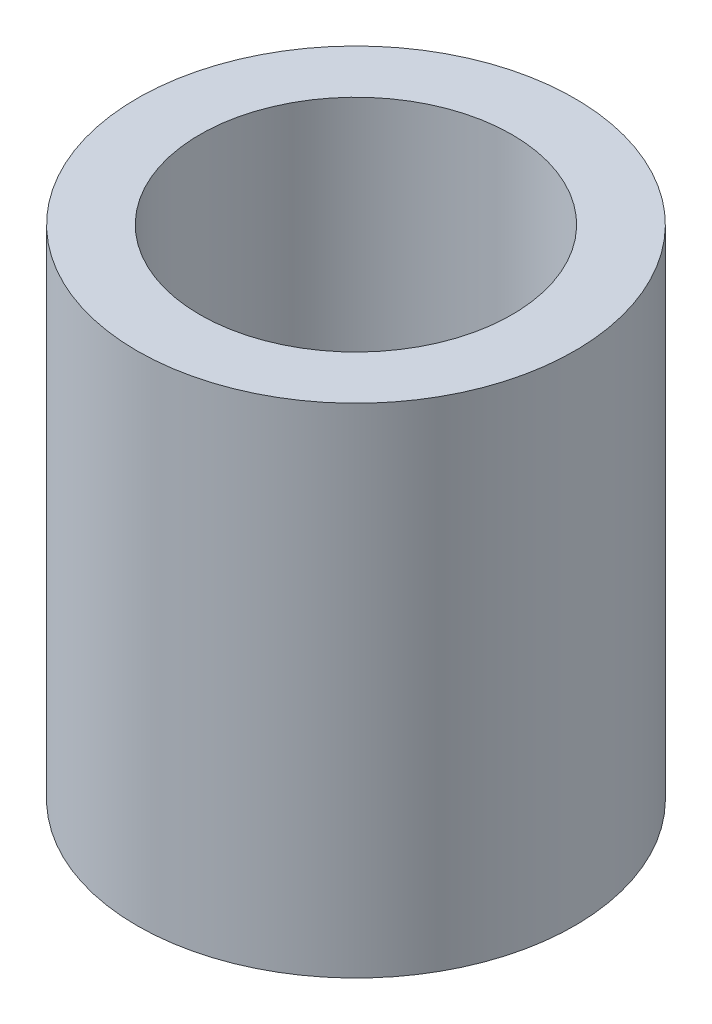
ISO-10303-21;
HEADER;
FILE_DESCRIPTION(('STEP AP214'),'2;1');
FILE_NAME('part.step','',(''),(''),'','','');
FILE_SCHEMA(('AUTOMOTIVE_DESIGN { 1 0 10303 214 1 1 1 1 }'));
ENDSEC;
DATA;
#1=APPLICATION_CONTEXT('core data for automotive mechanical design processes');
#2=APPLICATION_PROTOCOL_DEFINITION('international standard','automotive_design',2000,#1);
#3=PRODUCT_CONTEXT('',#1,'mechanical');
#4=PRODUCT('Part','Part','',(#3));
#5=PRODUCT_RELATED_PRODUCT_CATEGORY('part','',(#4));
#6=PRODUCT_DEFINITION_FORMATION('','',#4);
#7=PRODUCT_DEFINITION_CONTEXT('part definition',#1,'design');
#8=PRODUCT_DEFINITION('design','',#6,#7);
#9=PRODUCT_DEFINITION_SHAPE('','',#8);
#10=(LENGTH_UNIT() NAMED_UNIT(*) SI_UNIT(.MILLI.,.METRE.));
#11=(NAMED_UNIT(*) PLANE_ANGLE_UNIT() SI_UNIT($,.RADIAN.));
#12=(NAMED_UNIT(*) SI_UNIT($,.STERADIAN.) SOLID_ANGLE_UNIT());
#13=UNCERTAINTY_MEASURE_WITH_UNIT(LENGTH_MEASURE(1.E-05),#10,'distance_accuracy_value','');
#14=(GEOMETRIC_REPRESENTATION_CONTEXT(3) GLOBAL_UNCERTAINTY_ASSIGNED_CONTEXT((#13)) GLOBAL_UNIT_ASSIGNED_CONTEXT((#10,
#11,#12)) REPRESENTATION_CONTEXT('',''));
#15=CARTESIAN_POINT('',(0.,0.,0.));
#16=DIRECTION('',(0.,0.,1.));
#17=DIRECTION('',(1.,0.,0.));
#18=AXIS2_PLACEMENT_3D('',#15,#16,#17);
#19=CARTESIAN_POINT('',(0.,12.7,0.));
#20=DIRECTION('',(0.,1.,0.));
#21=DIRECTION('',(0.,0.,1.));
#22=AXIS2_PLACEMENT_3D('',#19,#20,#21);
#23=PLANE('',#22);
#24=CARTESIAN_POINT('',(0.,12.7,0.));
#25=DIRECTION('',(0.,1.,0.));
#26=DIRECTION('',(0.,0.,1.));
#27=AXIS2_PLACEMENT_3D('',#24,#25,#26);
#28=CIRCLE('',#27,5.58165);
#29=CARTESIAN_POINT('',(0.,12.7,5.58165));
#30=VERTEX_POINT('',#29);
#31=EDGE_CURVE('E10',#30,#30,#28,.T.);
#32=ORIENTED_EDGE('',*,*,#31,.T.);
#33=EDGE_LOOP('',(#32));
#34=FACE_BOUND('',#33,.T.);
#35=CARTESIAN_POINT('',(0.,12.7,0.));
#36=DIRECTION('',(0.,1.,0.));
#37=DIRECTION('',(0.,0.,1.));
#38=AXIS2_PLACEMENT_3D('',#35,#36,#37);
#39=CIRCLE('',#38,3.98145);
#40=CARTESIAN_POINT('',(0.,12.7,3.98145));
#41=VERTEX_POINT('',#40);
#42=EDGE_CURVE('E42',#41,#41,#39,.T.);
#43=ORIENTED_EDGE('',*,*,#42,.F.);
#44=EDGE_LOOP('',(#43));
#45=FACE_BOUND('',#44,.T.);
#46=ADVANCED_FACE('F31',(#34,#45),#23,.T.);
#47=CARTESIAN_POINT('',(0.,0.,0.));
#48=DIRECTION('',(0.,1.,0.));
#49=DIRECTION('',(0.,0.,1.));
#50=AXIS2_PLACEMENT_3D('',#47,#48,#49);
#51=PLANE('',#50);
#52=CARTESIAN_POINT('',(0.,0.,0.));
#53=DIRECTION('',(0.,1.,0.));
#54=DIRECTION('',(0.,0.,1.));
#55=AXIS2_PLACEMENT_3D('',#52,#53,#54);
#56=CIRCLE('',#55,5.58165);
#57=CARTESIAN_POINT('',(0.,0.,5.58165));
#58=VERTEX_POINT('',#57);
#59=EDGE_CURVE('E35',#58,#58,#56,.T.);
#60=ORIENTED_EDGE('',*,*,#59,.F.);
#61=EDGE_LOOP('',(#60));
#62=FACE_BOUND('',#61,.T.);
#63=CARTESIAN_POINT('',(0.,0.,0.));
#64=DIRECTION('',(0.,1.,0.));
#65=DIRECTION('',(0.,0.,1.));
#66=AXIS2_PLACEMENT_3D('',#63,#64,#65);
#67=CIRCLE('',#66,3.98145);
#68=CARTESIAN_POINT('',(0.,0.,3.98145));
#69=VERTEX_POINT('',#68);
#70=EDGE_CURVE('E44',#69,#69,#67,.T.);
#71=ORIENTED_EDGE('',*,*,#70,.T.);
#72=EDGE_LOOP('',(#71));
#73=FACE_BOUND('',#72,.T.);
#74=ADVANCED_FACE('F54',(#62,#73),#51,.F.);
#75=CARTESIAN_POINT('',(0.,12.7,0.));
#76=DIRECTION('',(0.,-1.,0.));
#77=DIRECTION('',(0.,0.,-1.));
#78=AXIS2_PLACEMENT_3D('',#75,#76,#77);
#79=CYLINDRICAL_SURFACE('',#78,5.58165);
#80=ORIENTED_EDGE('',*,*,#31,.F.);
#81=EDGE_LOOP('',(#80));
#82=FACE_BOUND('',#81,.T.);
#83=ORIENTED_EDGE('',*,*,#59,.T.);
#84=EDGE_LOOP('',(#83));
#85=FACE_BOUND('',#84,.T.);
#86=ADVANCED_FACE('F33',(#82,#85),#79,.T.);
#87=CARTESIAN_POINT('',(0.,12.7,0.));
#88=DIRECTION('',(0.,-1.,0.));
#89=DIRECTION('',(0.,0.,-1.));
#90=AXIS2_PLACEMENT_3D('',#87,#88,#89);
#91=CYLINDRICAL_SURFACE('',#90,3.98145);
#92=ORIENTED_EDGE('',*,*,#42,.T.);
#93=EDGE_LOOP('',(#92));
#94=FACE_BOUND('',#93,.T.);
#95=ORIENTED_EDGE('',*,*,#70,.F.);
#96=EDGE_LOOP('',(#95));
#97=FACE_BOUND('',#96,.T.);
#98=ADVANCED_FACE('F50',(#94,#97),#91,.F.);
#99=CLOSED_SHELL('',(#46,#74,#86,#98));
#100=MANIFOLD_SOLID_BREP('B2',#99);
#101=ADVANCED_BREP_SHAPE_REPRESENTATION('',(#18,#100),#14);
#102=SHAPE_DEFINITION_REPRESENTATION(#9,#101);
ENDSEC;
END-ISO-10303-21;
